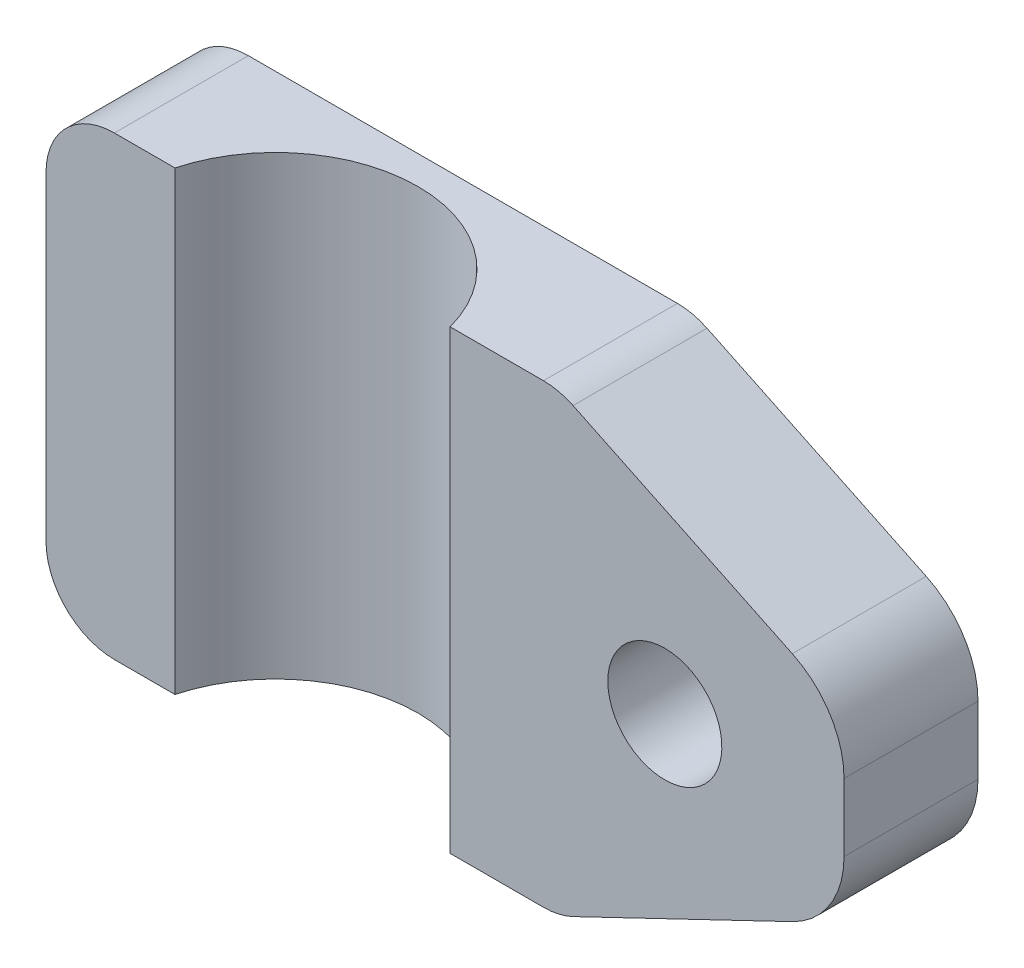
ISO-10303-21;
HEADER;
FILE_DESCRIPTION(('STEP AP214'),'2;1');
FILE_NAME('part.step','',(''),(''),'','','');
FILE_SCHEMA(('AUTOMOTIVE_DESIGN { 1 0 10303 214 1 1 1 1 }'));
ENDSEC;
DATA;
#1=APPLICATION_CONTEXT('core data for automotive mechanical design processes');
#2=APPLICATION_PROTOCOL_DEFINITION('international standard','automotive_design',2000,#1);
#3=PRODUCT_CONTEXT('',#1,'mechanical');
#4=PRODUCT('Part','Part','',(#3));
#5=PRODUCT_RELATED_PRODUCT_CATEGORY('part','',(#4));
#6=PRODUCT_DEFINITION_FORMATION('','',#4);
#7=PRODUCT_DEFINITION_CONTEXT('part definition',#1,'design');
#8=PRODUCT_DEFINITION('design','',#6,#7);
#9=PRODUCT_DEFINITION_SHAPE('','',#8);
#10=(LENGTH_UNIT() NAMED_UNIT(*) SI_UNIT(.MILLI.,.METRE.));
#11=(NAMED_UNIT(*) PLANE_ANGLE_UNIT() SI_UNIT($,.RADIAN.));
#12=(NAMED_UNIT(*) SI_UNIT($,.STERADIAN.) SOLID_ANGLE_UNIT());
#13=UNCERTAINTY_MEASURE_WITH_UNIT(LENGTH_MEASURE(1.E-05),#10,'distance_accuracy_value','');
#14=(GEOMETRIC_REPRESENTATION_CONTEXT(3) GLOBAL_UNCERTAINTY_ASSIGNED_CONTEXT((#13)) GLOBAL_UNIT_ASSIGNED_CONTEXT((#10,
#11,#12)) REPRESENTATION_CONTEXT('',''));
#15=CARTESIAN_POINT('',(0.,0.,0.));
#16=DIRECTION('',(0.,0.,1.));
#17=DIRECTION('',(1.,0.,0.));
#18=AXIS2_PLACEMENT_3D('',#15,#16,#17);
#19=CARTESIAN_POINT('',(0.,20.,10.));
#20=DIRECTION('',(0.,0.,-1.));
#21=DIRECTION('',(-1.,0.,0.));
#22=AXIS2_PLACEMENT_3D('',#19,#20,#21);
#23=PLANE('',#22);
#24=CARTESIAN_POINT('',(19.2809617816466,0.,10.));
#25=DIRECTION('',(0.,0.,-1.));
#26=DIRECTION('',(-1.,0.,0.));
#27=AXIS2_PLACEMENT_3D('',#24,#25,#26);
#28=CIRCLE('',#27,5.);
#29=CARTESIAN_POINT('',(14.2809617816466,0.,10.));
#30=VERTEX_POINT('',#29);
#31=EDGE_CURVE('E195',#30,#30,#28,.T.);
#32=ORIENTED_EDGE('',*,*,#31,.F.);
#33=EDGE_LOOP('',(#32));
#34=FACE_BOUND('',#33,.T.);
#35=DIRECTION('',(1.,0.,0.));
#36=VECTOR('',#35,1.);
#37=CARTESIAN_POINT('',(0.,-20.,10.));
#38=LINE('',#37,#36);
#39=CARTESIAN_POINT('',(-29.,-20.,10.));
#40=VERTEX_POINT('',#39);
#41=CARTESIAN_POINT('',(8.63457537613796,-20.,10.));
#42=VERTEX_POINT('',#41);
#43=EDGE_CURVE('E232',#40,#42,#38,.T.);
#44=ORIENTED_EDGE('',*,*,#43,.F.);
#45=CARTESIAN_POINT('',(-29.,-14.,10.));
#46=DIRECTION('',(0.,0.,1.));
#47=DIRECTION('',(1.,0.,0.));
#48=AXIS2_PLACEMENT_3D('',#45,#46,#47);
#49=CIRCLE('',#48,6.);
#50=CARTESIAN_POINT('',(-35.,-14.,10.));
#51=VERTEX_POINT('',#50);
#52=EDGE_CURVE('E267',#51,#40,#49,.T.);
#53=ORIENTED_EDGE('',*,*,#52,.F.);
#54=DIRECTION('',(0.,-1.,0.));
#55=VECTOR('',#54,1.);
#56=CARTESIAN_POINT('',(-35.,-14.,10.));
#57=LINE('',#56,#55);
#58=CARTESIAN_POINT('',(-35.,14.,10.));
#59=VERTEX_POINT('',#58);
#60=EDGE_CURVE('E265',#59,#51,#57,.T.);
#61=ORIENTED_EDGE('',*,*,#60,.F.);
#62=CARTESIAN_POINT('',(-29.,14.,10.));
#63=DIRECTION('',(0.,0.,1.));
#64=DIRECTION('',(1.,0.,0.));
#65=AXIS2_PLACEMENT_3D('',#62,#63,#64);
#66=CIRCLE('',#65,6.);
#67=CARTESIAN_POINT('',(-29.,20.,10.));
#68=VERTEX_POINT('',#67);
#69=EDGE_CURVE('E210',#68,#59,#66,.T.);
#70=ORIENTED_EDGE('',*,*,#69,.F.);
#71=DIRECTION('',(1.,0.,0.));
#72=VECTOR('',#71,1.);
#73=CARTESIAN_POINT('',(0.,20.,10.));
#74=LINE('',#73,#72);
#75=CARTESIAN_POINT('',(8.63457537613795,20.,10.));
#76=VERTEX_POINT('',#75);
#77=EDGE_CURVE('E235',#68,#76,#74,.T.);
#78=ORIENTED_EDGE('',*,*,#77,.T.);
#79=CARTESIAN_POINT('',(8.63457537613795,14.,10.));
#80=DIRECTION('',(0.,0.,1.));
#81=DIRECTION('',(1.,0.,0.));
#82=AXIS2_PLACEMENT_3D('',#79,#80,#81);
#83=CIRCLE('',#82,6.);
#84=CARTESIAN_POINT('',(11.2309617816466,19.4091383448096,10.));
#85=VERTEX_POINT('',#84);
#86=EDGE_CURVE('E258',#85,#76,#83,.T.);
#87=ORIENTED_EDGE('',*,*,#86,.F.);
#88=DIRECTION('',(-0.901523057468274,0.432731067584771,0.));
#89=VECTOR('',#88,1.);
#90=CARTESIAN_POINT('',(11.2309617816466,19.4091383448096,10.));
#91=LINE('',#90,#89);
#92=CARTESIAN_POINT('',(30.4618485406782,10.1783127004745,10.));
#93=VERTEX_POINT('',#92);
#94=EDGE_CURVE('E255',#93,#85,#91,.T.);
#95=ORIENTED_EDGE('',*,*,#94,.F.);
#96=CARTESIAN_POINT('',(27.,2.96612824072829,10.));
#97=DIRECTION('',(0.,0.,1.));
#98=DIRECTION('',(1.,0.,0.));
#99=AXIS2_PLACEMENT_3D('',#96,#97,#98);
#100=CIRCLE('',#99,8.00000000000001);
#101=CARTESIAN_POINT('',(35.,2.96612824072829,10.));
#102=VERTEX_POINT('',#101);
#103=EDGE_CURVE('E252',#102,#93,#100,.T.);
#104=ORIENTED_EDGE('',*,*,#103,.F.);
#105=DIRECTION('',(0.,1.,0.));
#106=VECTOR('',#105,1.);
#107=CARTESIAN_POINT('',(35.,2.96612824072829,10.));
#108=LINE('',#107,#106);
#109=CARTESIAN_POINT('',(35.,-2.96612824072827,10.));
#110=VERTEX_POINT('',#109);
#111=EDGE_CURVE('E249',#110,#102,#108,.T.);
#112=ORIENTED_EDGE('',*,*,#111,.F.);
#113=CARTESIAN_POINT('',(27.,-2.96612824072827,10.));
#114=DIRECTION('',(0.,0.,1.));
#115=DIRECTION('',(1.,0.,0.));
#116=AXIS2_PLACEMENT_3D('',#113,#114,#115);
#117=CIRCLE('',#116,8.);
#118=CARTESIAN_POINT('',(30.4618485406782,-10.1783127004745,10.));
#119=VERTEX_POINT('',#118);
#120=EDGE_CURVE('E246',#119,#110,#117,.T.);
#121=ORIENTED_EDGE('',*,*,#120,.F.);
#122=DIRECTION('',(0.901523057468274,0.432731067584772,0.));
#123=VECTOR('',#122,1.);
#124=CARTESIAN_POINT('',(11.2309617816466,-19.4091383448096,10.));
#125=LINE('',#124,#123);
#126=CARTESIAN_POINT('',(11.2309617816466,-19.4091383448096,10.));
#127=VERTEX_POINT('',#126);
#128=EDGE_CURVE('E236',#127,#119,#125,.T.);
#129=ORIENTED_EDGE('',*,*,#128,.F.);
#130=CARTESIAN_POINT('',(8.63457537613795,-14.,10.));
#131=DIRECTION('',(0.,0.,1.));
#132=DIRECTION('',(1.,0.,0.));
#133=AXIS2_PLACEMENT_3D('',#130,#131,#132);
#134=CIRCLE('',#133,6.00000000000001);
#135=EDGE_CURVE('E261',#42,#127,#134,.T.);
#136=ORIENTED_EDGE('',*,*,#135,.F.);
#137=EDGE_LOOP('',(#44,#53,#61,#70,#78,#87,#95,#104,#112,#121,#129,#136));
#138=FACE_BOUND('',#137,.T.);
#139=DIRECTION('',(0.,-1.,0.));
#140=VECTOR('',#139,1.);
#141=CARTESIAN_POINT('',(5.63457537613795,11.,10.));
#142=LINE('',#141,#140);
#143=CARTESIAN_POINT('',(5.63457537613795,11.,10.));
#144=VERTEX_POINT('',#143);
#145=CARTESIAN_POINT('',(5.63457537613795,-10.9999999999999,10.));
#146=VERTEX_POINT('',#145);
#147=EDGE_CURVE('E288',#144,#146,#142,.T.);
#148=ORIENTED_EDGE('',*,*,#147,.F.);
#149=CARTESIAN_POINT('',(2.63457537613795,11.,10.));
#150=DIRECTION('',(0.,0.,1.));
#151=DIRECTION('',(1.,0.,0.));
#152=AXIS2_PLACEMENT_3D('',#149,#150,#151);
#153=CIRCLE('',#152,3.);
#154=CARTESIAN_POINT('',(2.63457537613791,14.,10.));
#155=VERTEX_POINT('',#154);
#156=EDGE_CURVE('E310',#144,#155,#153,.T.);
#157=ORIENTED_EDGE('',*,*,#156,.T.);
#158=DIRECTION('',(1.,0.,0.));
#159=VECTOR('',#158,1.);
#160=CARTESIAN_POINT('',(-26.,14.,10.));
#161=LINE('',#160,#159);
#162=CARTESIAN_POINT('',(-26.,14.,10.));
#163=VERTEX_POINT('',#162);
#164=EDGE_CURVE('E307',#163,#155,#161,.T.);
#165=ORIENTED_EDGE('',*,*,#164,.F.);
#166=CARTESIAN_POINT('',(-26.,11.,10.));
#167=DIRECTION('',(0.,0.,1.));
#168=DIRECTION('',(1.,0.,0.));
#169=AXIS2_PLACEMENT_3D('',#166,#167,#168);
#170=CIRCLE('',#169,3.);
#171=CARTESIAN_POINT('',(-29.,11.,10.));
#172=VERTEX_POINT('',#171);
#173=EDGE_CURVE('E304',#163,#172,#170,.T.);
#174=ORIENTED_EDGE('',*,*,#173,.T.);
#175=DIRECTION('',(0.,1.,0.));
#176=VECTOR('',#175,1.);
#177=CARTESIAN_POINT('',(-29.,-11.,10.));
#178=LINE('',#177,#176);
#179=CARTESIAN_POINT('',(-29.,-11.,10.));
#180=VERTEX_POINT('',#179);
#181=EDGE_CURVE('E301',#180,#172,#178,.T.);
#182=ORIENTED_EDGE('',*,*,#181,.F.);
#183=CARTESIAN_POINT('',(-26.,-11.,10.));
#184=DIRECTION('',(0.,0.,1.));
#185=DIRECTION('',(1.,0.,0.));
#186=AXIS2_PLACEMENT_3D('',#183,#184,#185);
#187=CIRCLE('',#186,3.);
#188=CARTESIAN_POINT('',(-26.,-14.,10.));
#189=VERTEX_POINT('',#188);
#190=EDGE_CURVE('E298',#180,#189,#187,.T.);
#191=ORIENTED_EDGE('',*,*,#190,.T.);
#192=DIRECTION('',(-1.,0.,0.));
#193=VECTOR('',#192,1.);
#194=CARTESIAN_POINT('',(2.63457537613792,-14.,10.));
#195=LINE('',#194,#193);
#196=CARTESIAN_POINT('',(2.63457537613792,-14.,10.));
#197=VERTEX_POINT('',#196);
#198=EDGE_CURVE('E295',#197,#189,#195,.T.);
#199=ORIENTED_EDGE('',*,*,#198,.F.);
#200=CARTESIAN_POINT('',(2.63457537613796,-11.,10.));
#201=DIRECTION('',(0.,0.,1.));
#202=DIRECTION('',(1.,0.,0.));
#203=AXIS2_PLACEMENT_3D('',#200,#201,#202);
#204=CIRCLE('',#203,3.);
#205=EDGE_CURVE('E292',#197,#146,#204,.T.);
#206=ORIENTED_EDGE('',*,*,#205,.T.);
#207=EDGE_LOOP('',(#148,#157,#165,#174,#182,#191,#199,#206));
#208=FACE_BOUND('',#207,.T.);
#209=ADVANCED_FACE('F38',(#34,#138,#208),#23,.T.);
#210=CARTESIAN_POINT('',(-29.,20.,25.));
#211=DIRECTION('',(0.,-1.,0.));
#212=DIRECTION('',(1.,0.,0.));
#213=AXIS2_PLACEMENT_3D('',#210,#211,#212);
#214=PLANE('',#213);
#215=DIRECTION('',(0.,0.,-1.));
#216=VECTOR('',#215,1.);
#217=CARTESIAN_POINT('',(-29.,20.,25.));
#218=LINE('',#217,#216);
#219=CARTESIAN_POINT('',(-29.,20.,21.75));
#220=VERTEX_POINT('',#219);
#221=EDGE_CURVE('E47',#220,#68,#218,.T.);
#222=ORIENTED_EDGE('',*,*,#221,.F.);
#223=DIRECTION('',(-1.,0.,0.));
#224=VECTOR('',#223,1.);
#225=CARTESIAN_POINT('',(35.,20.,21.75));
#226=LINE('',#225,#224);
#227=CARTESIAN_POINT('',(-23.6900768243044,20.,21.75));
#228=VERTEX_POINT('',#227);
#229=EDGE_CURVE('E191',#228,#220,#226,.T.);
#230=ORIENTED_EDGE('',*,*,#229,.F.);
#231=CARTESIAN_POINT('',(-11.619969119731,20.,25.));
#232=DIRECTION('',(0.,-1.,0.));
#233=DIRECTION('',(1.,0.,0.));
#234=AXIS2_PLACEMENT_3D('',#231,#232,#233);
#235=CIRCLE('',#234,12.5);
#236=CARTESIAN_POINT('',(0.450138584842276,20.,21.75));
#237=VERTEX_POINT('',#236);
#238=EDGE_CURVE('E231',#228,#237,#235,.T.);
#239=ORIENTED_EDGE('',*,*,#238,.T.);
#240=CARTESIAN_POINT('',(8.63457537613795,20.,21.75));
#241=VERTEX_POINT('',#240);
#242=EDGE_CURVE('E54',#241,#237,#226,.T.);
#243=ORIENTED_EDGE('',*,*,#242,.F.);
#244=DIRECTION('',(0.,0.,-1.));
#245=VECTOR('',#244,1.);
#246=CARTESIAN_POINT('',(8.63457537613795,20.,25.));
#247=LINE('',#246,#245);
#248=EDGE_CURVE('E12',#241,#76,#247,.T.);
#249=ORIENTED_EDGE('',*,*,#248,.T.);
#250=ORIENTED_EDGE('',*,*,#77,.F.);
#251=EDGE_LOOP('',(#222,#230,#239,#243,#249,#250));
#252=FACE_BOUND('',#251,.T.);
#253=ADVANCED_FACE('F392',(#252),#214,.F.);
#254=CARTESIAN_POINT('',(-29.,-20.,25.));
#255=DIRECTION('',(0.,1.,0.));
#256=DIRECTION('',(-1.,0.,0.));
#257=AXIS2_PLACEMENT_3D('',#254,#255,#256);
#258=PLANE('',#257);
#259=DIRECTION('',(0.,0.,-1.));
#260=VECTOR('',#259,1.);
#261=CARTESIAN_POINT('',(8.63457537613796,-20.,25.));
#262=LINE('',#261,#260);
#263=CARTESIAN_POINT('',(8.63457537613795,-20.,21.75));
#264=VERTEX_POINT('',#263);
#265=EDGE_CURVE('E217',#264,#42,#262,.T.);
#266=ORIENTED_EDGE('',*,*,#265,.F.);
#267=DIRECTION('',(-1.,0.,0.));
#268=VECTOR('',#267,1.);
#269=CARTESIAN_POINT('',(35.,-20.,21.75));
#270=LINE('',#269,#268);
#271=CARTESIAN_POINT('',(0.450138584842281,-20.,21.75));
#272=VERTEX_POINT('',#271);
#273=EDGE_CURVE('E357',#264,#272,#270,.T.);
#274=ORIENTED_EDGE('',*,*,#273,.T.);
#275=CARTESIAN_POINT('',(-11.619969119731,-20.,25.));
#276=DIRECTION('',(0.,-1.,0.));
#277=DIRECTION('',(1.,0.,0.));
#278=AXIS2_PLACEMENT_3D('',#275,#276,#277);
#279=CIRCLE('',#278,12.5);
#280=CARTESIAN_POINT('',(-23.6900768243043,-20.,21.75));
#281=VERTEX_POINT('',#280);
#282=EDGE_CURVE('E239',#281,#272,#279,.T.);
#283=ORIENTED_EDGE('',*,*,#282,.F.);
#284=CARTESIAN_POINT('',(-29.,-20.,21.75));
#285=VERTEX_POINT('',#284);
#286=EDGE_CURVE('E62',#281,#285,#270,.T.);
#287=ORIENTED_EDGE('',*,*,#286,.T.);
#288=DIRECTION('',(0.,0.,-1.));
#289=VECTOR('',#288,1.);
#290=CARTESIAN_POINT('',(-29.,-20.,25.));
#291=LINE('',#290,#289);
#292=EDGE_CURVE('E213',#285,#40,#291,.T.);
#293=ORIENTED_EDGE('',*,*,#292,.T.);
#294=ORIENTED_EDGE('',*,*,#43,.T.);
#295=EDGE_LOOP('',(#266,#274,#283,#287,#293,#294));
#296=FACE_BOUND('',#295,.T.);
#297=ADVANCED_FACE('F383',(#296),#258,.F.);
#298=CARTESIAN_POINT('',(8.63457537613795,14.,25.));
#299=DIRECTION('',(0.,0.,-1.));
#300=DIRECTION('',(-1.,0.,0.));
#301=AXIS2_PLACEMENT_3D('',#298,#299,#300);
#302=CYLINDRICAL_SURFACE('',#301,6.);
#303=ORIENTED_EDGE('',*,*,#248,.F.);
#304=CARTESIAN_POINT('',(8.63457537613795,14.,21.75));
#305=DIRECTION('',(0.,0.,-1.));
#306=DIRECTION('',(0.,1.,0.));
#307=AXIS2_PLACEMENT_3D('',#304,#305,#306);
#308=CIRCLE('',#307,6.);
#309=CARTESIAN_POINT('',(11.2309617816466,19.4091383448096,21.75));
#310=VERTEX_POINT('',#309);
#311=EDGE_CURVE('E343',#241,#310,#308,.T.);
#312=ORIENTED_EDGE('',*,*,#311,.T.);
#313=DIRECTION('',(0.,0.,-1.));
#314=VECTOR('',#313,1.);
#315=CARTESIAN_POINT('',(11.2309617816466,19.4091383448096,25.));
#316=LINE('',#315,#314);
#317=EDGE_CURVE('E229',#310,#85,#316,.T.);
#318=ORIENTED_EDGE('',*,*,#317,.T.);
#319=ORIENTED_EDGE('',*,*,#86,.T.);
#320=EDGE_LOOP('',(#303,#312,#318,#319));
#321=FACE_BOUND('',#320,.T.);
#322=ADVANCED_FACE('F40',(#321),#302,.T.);
#323=CARTESIAN_POINT('',(-29.,14.,25.));
#324=DIRECTION('',(0.,0.,-1.));
#325=DIRECTION('',(-1.,0.,0.));
#326=AXIS2_PLACEMENT_3D('',#323,#324,#325);
#327=CYLINDRICAL_SURFACE('',#326,6.);
#328=DIRECTION('',(0.,0.,-1.));
#329=VECTOR('',#328,1.);
#330=CARTESIAN_POINT('',(-35.,14.,25.));
#331=LINE('',#330,#329);
#332=CARTESIAN_POINT('',(-35.,14.,21.75));
#333=VERTEX_POINT('',#332);
#334=EDGE_CURVE('E202',#333,#59,#331,.T.);
#335=ORIENTED_EDGE('',*,*,#334,.F.);
#336=CARTESIAN_POINT('',(-29.,14.,21.75));
#337=DIRECTION('',(0.,0.,-1.));
#338=DIRECTION('',(0.,1.,0.));
#339=AXIS2_PLACEMENT_3D('',#336,#337,#338);
#340=CIRCLE('',#339,6.);
#341=EDGE_CURVE('E185',#333,#220,#340,.T.);
#342=ORIENTED_EDGE('',*,*,#341,.T.);
#343=ORIENTED_EDGE('',*,*,#221,.T.);
#344=ORIENTED_EDGE('',*,*,#69,.T.);
#345=EDGE_LOOP('',(#335,#342,#343,#344));
#346=FACE_BOUND('',#345,.T.);
#347=ADVANCED_FACE('F208',(#346),#327,.T.);
#348=CARTESIAN_POINT('',(-35.,-14.,25.));
#349=DIRECTION('',(1.,0.,0.));
#350=DIRECTION('',(0.,1.,0.));
#351=AXIS2_PLACEMENT_3D('',#348,#349,#350);
#352=PLANE('',#351);
#353=DIRECTION('',(0.,0.,-1.));
#354=VECTOR('',#353,1.);
#355=CARTESIAN_POINT('',(-35.,-14.,25.));
#356=LINE('',#355,#354);
#357=CARTESIAN_POINT('',(-35.,-14.,21.75));
#358=VERTEX_POINT('',#357);
#359=EDGE_CURVE('E204',#358,#51,#356,.T.);
#360=ORIENTED_EDGE('',*,*,#359,.F.);
#361=DIRECTION('',(0.,-1.,0.));
#362=VECTOR('',#361,1.);
#363=CARTESIAN_POINT('',(-35.,20.,21.75));
#364=LINE('',#363,#362);
#365=EDGE_CURVE('E188',#333,#358,#364,.T.);
#366=ORIENTED_EDGE('',*,*,#365,.F.);
#367=ORIENTED_EDGE('',*,*,#334,.T.);
#368=ORIENTED_EDGE('',*,*,#60,.T.);
#369=EDGE_LOOP('',(#360,#366,#367,#368));
#370=FACE_BOUND('',#369,.T.);
#371=ADVANCED_FACE('F200',(#370),#352,.F.);
#372=CARTESIAN_POINT('',(-29.,-14.,25.));
#373=DIRECTION('',(0.,0.,-1.));
#374=DIRECTION('',(-1.,0.,0.));
#375=AXIS2_PLACEMENT_3D('',#372,#373,#374);
#376=CYLINDRICAL_SURFACE('',#375,6.);
#377=ORIENTED_EDGE('',*,*,#292,.F.);
#378=CARTESIAN_POINT('',(-29.,-14.,21.75));
#379=DIRECTION('',(0.,0.,-1.));
#380=DIRECTION('',(0.,1.,0.));
#381=AXIS2_PLACEMENT_3D('',#378,#379,#380);
#382=CIRCLE('',#381,6.);
#383=EDGE_CURVE('E196',#285,#358,#382,.T.);
#384=ORIENTED_EDGE('',*,*,#383,.T.);
#385=ORIENTED_EDGE('',*,*,#359,.T.);
#386=ORIENTED_EDGE('',*,*,#52,.T.);
#387=EDGE_LOOP('',(#377,#384,#385,#386));
#388=FACE_BOUND('',#387,.T.);
#389=ADVANCED_FACE('F388',(#388),#376,.T.);
#390=CARTESIAN_POINT('',(8.63457537613795,-14.,25.));
#391=DIRECTION('',(0.,0.,-1.));
#392=DIRECTION('',(-1.,0.,0.));
#393=AXIS2_PLACEMENT_3D('',#390,#391,#392);
#394=CYLINDRICAL_SURFACE('',#393,6.00000000000001);
#395=DIRECTION('',(0.,0.,-1.));
#396=VECTOR('',#395,1.);
#397=CARTESIAN_POINT('',(11.2309617816466,-19.4091383448096,25.));
#398=LINE('',#397,#396);
#399=CARTESIAN_POINT('',(11.2309617816466,-19.4091383448096,21.75));
#400=VERTEX_POINT('',#399);
#401=EDGE_CURVE('E219',#400,#127,#398,.T.);
#402=ORIENTED_EDGE('',*,*,#401,.F.);
#403=CARTESIAN_POINT('',(8.63457537613795,-14.,21.75));
#404=DIRECTION('',(0.,0.,-1.));
#405=DIRECTION('',(0.,1.,0.));
#406=AXIS2_PLACEMENT_3D('',#403,#404,#405);
#407=CIRCLE('',#406,6.00000000000001);
#408=EDGE_CURVE('E334',#400,#264,#407,.T.);
#409=ORIENTED_EDGE('',*,*,#408,.T.);
#410=ORIENTED_EDGE('',*,*,#265,.T.);
#411=ORIENTED_EDGE('',*,*,#135,.T.);
#412=EDGE_LOOP('',(#402,#409,#410,#411));
#413=FACE_BOUND('',#412,.T.);
#414=ADVANCED_FACE('F379',(#413),#394,.T.);
#415=CARTESIAN_POINT('',(11.2309617816466,-19.4091383448096,25.));
#416=DIRECTION('',(-0.432731067584772,0.901523057468274,0.));
#417=DIRECTION('',(-0.901523057468274,-0.432731067584772,0.));
#418=AXIS2_PLACEMENT_3D('',#415,#416,#417);
#419=PLANE('',#418);
#420=DIRECTION('',(0.,0.,-1.));
#421=VECTOR('',#420,1.);
#422=CARTESIAN_POINT('',(30.4618485406782,-10.1783127004745,25.));
#423=LINE('',#422,#421);
#424=CARTESIAN_POINT('',(30.4618485406782,-10.1783127004745,21.75));
#425=VERTEX_POINT('',#424);
#426=EDGE_CURVE('E221',#425,#119,#423,.T.);
#427=ORIENTED_EDGE('',*,*,#426,.F.);
#428=DIRECTION('',(-0.901523057468274,-0.432731067584772,0.));
#429=VECTOR('',#428,1.);
#430=CARTESIAN_POINT('',(11.2309617816466,-19.4091383448096,21.75));
#431=LINE('',#430,#429);
#432=EDGE_CURVE('E337',#425,#400,#431,.T.);
#433=ORIENTED_EDGE('',*,*,#432,.T.);
#434=ORIENTED_EDGE('',*,*,#401,.T.);
#435=ORIENTED_EDGE('',*,*,#128,.T.);
#436=EDGE_LOOP('',(#427,#433,#434,#435));
#437=FACE_BOUND('',#436,.T.);
#438=ADVANCED_FACE('F376',(#437),#419,.F.);
#439=CARTESIAN_POINT('',(27.,-2.96612824072827,25.));
#440=DIRECTION('',(0.,0.,-1.));
#441=DIRECTION('',(-1.,0.,0.));
#442=AXIS2_PLACEMENT_3D('',#439,#440,#441);
#443=CYLINDRICAL_SURFACE('',#442,8.);
#444=DIRECTION('',(0.,0.,-1.));
#445=VECTOR('',#444,1.);
#446=CARTESIAN_POINT('',(35.,-2.96612824072827,25.));
#447=LINE('',#446,#445);
#448=CARTESIAN_POINT('',(35.,-2.96612824072827,21.75));
#449=VERTEX_POINT('',#448);
#450=EDGE_CURVE('E223',#449,#110,#447,.T.);
#451=ORIENTED_EDGE('',*,*,#450,.F.);
#452=CARTESIAN_POINT('',(27.,-2.96612824072827,21.75));
#453=DIRECTION('',(0.,0.,-1.));
#454=DIRECTION('',(0.,1.,0.));
#455=AXIS2_PLACEMENT_3D('',#452,#453,#454);
#456=CIRCLE('',#455,8.);
#457=EDGE_CURVE('E340',#449,#425,#456,.T.);
#458=ORIENTED_EDGE('',*,*,#457,.T.);
#459=ORIENTED_EDGE('',*,*,#426,.T.);
#460=ORIENTED_EDGE('',*,*,#120,.T.);
#461=EDGE_LOOP('',(#451,#458,#459,#460));
#462=FACE_BOUND('',#461,.T.);
#463=ADVANCED_FACE('F366',(#462),#443,.T.);
#464=CARTESIAN_POINT('',(35.,2.96612824072829,25.));
#465=DIRECTION('',(-1.,0.,0.));
#466=DIRECTION('',(0.,0.,1.));
#467=AXIS2_PLACEMENT_3D('',#464,#465,#466);
#468=PLANE('',#467);
#469=DIRECTION('',(0.,0.,-1.));
#470=VECTOR('',#469,1.);
#471=CARTESIAN_POINT('',(35.,2.96612824072829,25.));
#472=LINE('',#471,#470);
#473=CARTESIAN_POINT('',(35.,2.96612824072829,21.75));
#474=VERTEX_POINT('',#473);
#475=EDGE_CURVE('E225',#474,#102,#472,.T.);
#476=ORIENTED_EDGE('',*,*,#475,.F.);
#477=DIRECTION('',(0.,-1.,0.));
#478=VECTOR('',#477,1.);
#479=CARTESIAN_POINT('',(35.,20.,21.75));
#480=LINE('',#479,#478);
#481=EDGE_CURVE('E205',#474,#449,#480,.T.);
#482=ORIENTED_EDGE('',*,*,#481,.T.);
#483=ORIENTED_EDGE('',*,*,#450,.T.);
#484=ORIENTED_EDGE('',*,*,#111,.T.);
#485=EDGE_LOOP('',(#476,#482,#483,#484));
#486=FACE_BOUND('',#485,.T.);
#487=ADVANCED_FACE('F363',(#486),#468,.F.);
#488=CARTESIAN_POINT('',(27.,2.96612824072829,25.));
#489=DIRECTION('',(0.,0.,-1.));
#490=DIRECTION('',(-1.,0.,0.));
#491=AXIS2_PLACEMENT_3D('',#488,#489,#490);
#492=CYLINDRICAL_SURFACE('',#491,8.00000000000001);
#493=DIRECTION('',(0.,0.,-1.));
#494=VECTOR('',#493,1.);
#495=CARTESIAN_POINT('',(30.4618485406782,10.1783127004745,25.));
#496=LINE('',#495,#494);
#497=CARTESIAN_POINT('',(30.4618485406782,10.1783127004745,21.75));
#498=VERTEX_POINT('',#497);
#499=EDGE_CURVE('E227',#498,#93,#496,.T.);
#500=ORIENTED_EDGE('',*,*,#499,.F.);
#501=CARTESIAN_POINT('',(27.,2.96612824072829,21.75));
#502=DIRECTION('',(0.,0.,-1.));
#503=DIRECTION('',(0.,1.,0.));
#504=AXIS2_PLACEMENT_3D('',#501,#502,#503);
#505=CIRCLE('',#504,8.00000000000001);
#506=EDGE_CURVE('E346',#498,#474,#505,.T.);
#507=ORIENTED_EDGE('',*,*,#506,.T.);
#508=ORIENTED_EDGE('',*,*,#475,.T.);
#509=ORIENTED_EDGE('',*,*,#103,.T.);
#510=EDGE_LOOP('',(#500,#507,#508,#509));
#511=FACE_BOUND('',#510,.T.);
#512=ADVANCED_FACE('F401',(#511),#492,.T.);
#513=CARTESIAN_POINT('',(11.2309617816466,19.4091383448096,25.));
#514=DIRECTION('',(-0.432731067584771,-0.901523057468274,0.));
#515=DIRECTION('',(0.901523057468274,-0.432731067584771,0.));
#516=AXIS2_PLACEMENT_3D('',#513,#514,#515);
#517=PLANE('',#516);
#518=ORIENTED_EDGE('',*,*,#317,.F.);
#519=DIRECTION('',(0.901523057468274,-0.432731067584771,0.));
#520=VECTOR('',#519,1.);
#521=CARTESIAN_POINT('',(11.2309617816466,19.4091383448096,21.75));
#522=LINE('',#521,#520);
#523=EDGE_CURVE('E349',#310,#498,#522,.T.);
#524=ORIENTED_EDGE('',*,*,#523,.T.);
#525=ORIENTED_EDGE('',*,*,#499,.T.);
#526=ORIENTED_EDGE('',*,*,#94,.T.);
#527=EDGE_LOOP('',(#518,#524,#525,#526));
#528=FACE_BOUND('',#527,.T.);
#529=ADVANCED_FACE('F398',(#528),#517,.F.);
#530=CARTESIAN_POINT('',(-11.619969119731,20.,25.));
#531=DIRECTION('',(0.,-1.,0.));
#532=DIRECTION('',(1.,0.,0.));
#533=AXIS2_PLACEMENT_3D('',#530,#531,#532);
#534=CYLINDRICAL_SURFACE('',#533,12.5);
#535=ORIENTED_EDGE('',*,*,#282,.T.);
#536=DIRECTION('',(0.,-1.,0.));
#537=VECTOR('',#536,1.);
#538=CARTESIAN_POINT('',(0.450138584842276,20.,21.75));
#539=LINE('',#538,#537);
#540=EDGE_CURVE('E352',#272,#237,#539,.F.);
#541=ORIENTED_EDGE('',*,*,#540,.T.);
#542=ORIENTED_EDGE('',*,*,#238,.F.);
#543=DIRECTION('',(0.,-1.,0.));
#544=VECTOR('',#543,1.);
#545=CARTESIAN_POINT('',(-23.6900768243044,20.,21.75));
#546=LINE('',#545,#544);
#547=EDGE_CURVE('E354',#228,#281,#546,.T.);
#548=ORIENTED_EDGE('',*,*,#547,.T.);
#549=EDGE_LOOP('',(#535,#541,#542,#548));
#550=FACE_BOUND('',#549,.T.);
#551=ADVANCED_FACE('F426',(#550),#534,.F.);
#552=CARTESIAN_POINT('',(2.63457537613795,11.,11.));
#553=DIRECTION('',(0.,0.,-1.));
#554=DIRECTION('',(-1.,0.,0.));
#555=AXIS2_PLACEMENT_3D('',#552,#553,#554);
#556=CYLINDRICAL_SURFACE('',#555,3.);
#557=ORIENTED_EDGE('',*,*,#156,.F.);
#558=DIRECTION('',(0.,0.,-1.));
#559=VECTOR('',#558,1.);
#560=CARTESIAN_POINT('',(5.63457537613795,11.,11.));
#561=LINE('',#560,#559);
#562=CARTESIAN_POINT('',(5.63457537613795,11.,11.));
#563=VERTEX_POINT('',#562);
#564=EDGE_CURVE('E284',#563,#144,#561,.T.);
#565=ORIENTED_EDGE('',*,*,#564,.F.);
#566=CARTESIAN_POINT('',(2.63457537613795,11.,11.));
#567=DIRECTION('',(0.,0.,1.));
#568=DIRECTION('',(1.,0.,0.));
#569=AXIS2_PLACEMENT_3D('',#566,#567,#568);
#570=CIRCLE('',#569,3.);
#571=CARTESIAN_POINT('',(2.63457537613791,14.,11.));
#572=VERTEX_POINT('',#571);
#573=EDGE_CURVE('E291',#563,#572,#570,.T.);
#574=ORIENTED_EDGE('',*,*,#573,.T.);
#575=DIRECTION('',(0.,0.,-1.));
#576=VECTOR('',#575,1.);
#577=CARTESIAN_POINT('',(2.63457537613791,14.,11.));
#578=LINE('',#577,#576);
#579=EDGE_CURVE('E270',#572,#155,#578,.T.);
#580=ORIENTED_EDGE('',*,*,#579,.T.);
#581=EDGE_LOOP('',(#557,#565,#574,#580));
#582=FACE_BOUND('',#581,.T.);
#583=ADVANCED_FACE('F473',(#582),#556,.F.);
#584=CARTESIAN_POINT('',(-26.,14.,11.));
#585=DIRECTION('',(0.,1.,0.));
#586=DIRECTION('',(0.,0.,1.));
#587=AXIS2_PLACEMENT_3D('',#584,#585,#586);
#588=PLANE('',#587);
#589=ORIENTED_EDGE('',*,*,#164,.T.);
#590=ORIENTED_EDGE('',*,*,#579,.F.);
#591=DIRECTION('',(1.,0.,0.));
#592=VECTOR('',#591,1.);
#593=CARTESIAN_POINT('',(-26.,14.,11.));
#594=LINE('',#593,#592);
#595=CARTESIAN_POINT('',(-26.,14.,11.));
#596=VERTEX_POINT('',#595);
#597=EDGE_CURVE('E327',#596,#572,#594,.T.);
#598=ORIENTED_EDGE('',*,*,#597,.F.);
#599=DIRECTION('',(0.,0.,-1.));
#600=VECTOR('',#599,1.);
#601=CARTESIAN_POINT('',(-26.,14.,11.));
#602=LINE('',#601,#600);
#603=EDGE_CURVE('E272',#596,#163,#602,.T.);
#604=ORIENTED_EDGE('',*,*,#603,.T.);
#605=EDGE_LOOP('',(#589,#590,#598,#604));
#606=FACE_BOUND('',#605,.T.);
#607=ADVANCED_FACE('F489',(#606),#588,.F.);
#608=CARTESIAN_POINT('',(-26.,11.,11.));
#609=DIRECTION('',(0.,0.,-1.));
#610=DIRECTION('',(-1.,0.,0.));
#611=AXIS2_PLACEMENT_3D('',#608,#609,#610);
#612=CYLINDRICAL_SURFACE('',#611,3.);
#613=ORIENTED_EDGE('',*,*,#173,.F.);
#614=ORIENTED_EDGE('',*,*,#603,.F.);
#615=CARTESIAN_POINT('',(-26.,11.,11.));
#616=DIRECTION('',(0.,0.,1.));
#617=DIRECTION('',(1.,0.,0.));
#618=AXIS2_PLACEMENT_3D('',#615,#616,#617);
#619=CIRCLE('',#618,3.);
#620=CARTESIAN_POINT('',(-29.,11.,11.));
#621=VERTEX_POINT('',#620);
#622=EDGE_CURVE('E325',#596,#621,#619,.T.);
#623=ORIENTED_EDGE('',*,*,#622,.T.);
#624=DIRECTION('',(0.,0.,-1.));
#625=VECTOR('',#624,1.);
#626=CARTESIAN_POINT('',(-29.,11.,11.));
#627=LINE('',#626,#625);
#628=EDGE_CURVE('E274',#621,#172,#627,.T.);
#629=ORIENTED_EDGE('',*,*,#628,.T.);
#630=EDGE_LOOP('',(#613,#614,#623,#629));
#631=FACE_BOUND('',#630,.T.);
#632=ADVANCED_FACE('F497',(#631),#612,.F.);
#633=CARTESIAN_POINT('',(-29.,-11.,11.));
#634=DIRECTION('',(-1.,0.,0.));
#635=DIRECTION('',(0.,0.,1.));
#636=AXIS2_PLACEMENT_3D('',#633,#634,#635);
#637=PLANE('',#636);
#638=ORIENTED_EDGE('',*,*,#181,.T.);
#639=ORIENTED_EDGE('',*,*,#628,.F.);
#640=DIRECTION('',(0.,1.,0.));
#641=VECTOR('',#640,1.);
#642=CARTESIAN_POINT('',(-29.,-11.,11.));
#643=LINE('',#642,#641);
#644=CARTESIAN_POINT('',(-29.,-11.,11.));
#645=VERTEX_POINT('',#644);
#646=EDGE_CURVE('E322',#645,#621,#643,.T.);
#647=ORIENTED_EDGE('',*,*,#646,.F.);
#648=DIRECTION('',(0.,0.,-1.));
#649=VECTOR('',#648,1.);
#650=CARTESIAN_POINT('',(-29.,-11.,11.));
#651=LINE('',#650,#649);
#652=EDGE_CURVE('E276',#645,#180,#651,.T.);
#653=ORIENTED_EDGE('',*,*,#652,.T.);
#654=EDGE_LOOP('',(#638,#639,#647,#653));
#655=FACE_BOUND('',#654,.T.);
#656=ADVANCED_FACE('F506',(#655),#637,.F.);
#657=CARTESIAN_POINT('',(-26.,-11.,11.));
#658=DIRECTION('',(0.,0.,-1.));
#659=DIRECTION('',(-1.,0.,0.));
#660=AXIS2_PLACEMENT_3D('',#657,#658,#659);
#661=CYLINDRICAL_SURFACE('',#660,3.);
#662=ORIENTED_EDGE('',*,*,#190,.F.);
#663=ORIENTED_EDGE('',*,*,#652,.F.);
#664=CARTESIAN_POINT('',(-26.,-11.,11.));
#665=DIRECTION('',(0.,0.,1.));
#666=DIRECTION('',(1.,0.,0.));
#667=AXIS2_PLACEMENT_3D('',#664,#665,#666);
#668=CIRCLE('',#667,3.);
#669=CARTESIAN_POINT('',(-26.,-14.,11.));
#670=VERTEX_POINT('',#669);
#671=EDGE_CURVE('E320',#645,#670,#668,.T.);
#672=ORIENTED_EDGE('',*,*,#671,.T.);
#673=DIRECTION('',(0.,0.,-1.));
#674=VECTOR('',#673,1.);
#675=CARTESIAN_POINT('',(-26.,-14.,11.));
#676=LINE('',#675,#674);
#677=EDGE_CURVE('E278',#670,#189,#676,.T.);
#678=ORIENTED_EDGE('',*,*,#677,.T.);
#679=EDGE_LOOP('',(#662,#663,#672,#678));
#680=FACE_BOUND('',#679,.T.);
#681=ADVANCED_FACE('F515',(#680),#661,.F.);
#682=CARTESIAN_POINT('',(2.63457537613792,-14.,11.));
#683=DIRECTION('',(0.,-1.,0.));
#684=DIRECTION('',(0.,0.,-1.));
#685=AXIS2_PLACEMENT_3D('',#682,#683,#684);
#686=PLANE('',#685);
#687=ORIENTED_EDGE('',*,*,#198,.T.);
#688=ORIENTED_EDGE('',*,*,#677,.F.);
#689=DIRECTION('',(-1.,0.,0.));
#690=VECTOR('',#689,1.);
#691=CARTESIAN_POINT('',(2.63457537613792,-14.,11.));
#692=LINE('',#691,#690);
#693=CARTESIAN_POINT('',(2.63457537613792,-14.,11.));
#694=VERTEX_POINT('',#693);
#695=EDGE_CURVE('E317',#694,#670,#692,.T.);
#696=ORIENTED_EDGE('',*,*,#695,.F.);
#697=DIRECTION('',(0.,0.,-1.));
#698=VECTOR('',#697,1.);
#699=CARTESIAN_POINT('',(2.63457537613792,-14.,11.));
#700=LINE('',#699,#698);
#701=EDGE_CURVE('E280',#694,#197,#700,.T.);
#702=ORIENTED_EDGE('',*,*,#701,.T.);
#703=EDGE_LOOP('',(#687,#688,#696,#702));
#704=FACE_BOUND('',#703,.T.);
#705=ADVANCED_FACE('F524',(#704),#686,.F.);
#706=CARTESIAN_POINT('',(2.63457537613796,-11.,11.));
#707=DIRECTION('',(0.,0.,-1.));
#708=DIRECTION('',(-1.,0.,0.));
#709=AXIS2_PLACEMENT_3D('',#706,#707,#708);
#710=CYLINDRICAL_SURFACE('',#709,3.);
#711=ORIENTED_EDGE('',*,*,#205,.F.);
#712=ORIENTED_EDGE('',*,*,#701,.F.);
#713=CARTESIAN_POINT('',(2.63457537613796,-11.,11.));
#714=DIRECTION('',(0.,0.,1.));
#715=DIRECTION('',(1.,0.,0.));
#716=AXIS2_PLACEMENT_3D('',#713,#714,#715);
#717=CIRCLE('',#716,3.);
#718=CARTESIAN_POINT('',(5.63457537613795,-10.9999999999999,11.));
#719=VERTEX_POINT('',#718);
#720=EDGE_CURVE('E315',#694,#719,#717,.T.);
#721=ORIENTED_EDGE('',*,*,#720,.T.);
#722=DIRECTION('',(0.,0.,-1.));
#723=VECTOR('',#722,1.);
#724=CARTESIAN_POINT('',(5.63457537613795,-10.9999999999999,11.));
#725=LINE('',#724,#723);
#726=EDGE_CURVE('E282',#719,#146,#725,.T.);
#727=ORIENTED_EDGE('',*,*,#726,.T.);
#728=EDGE_LOOP('',(#711,#712,#721,#727));
#729=FACE_BOUND('',#728,.T.);
#730=ADVANCED_FACE('F533',(#729),#710,.F.);
#731=CARTESIAN_POINT('',(5.63457537613795,11.,11.));
#732=DIRECTION('',(1.,0.,0.));
#733=DIRECTION('',(0.,1.,0.));
#734=AXIS2_PLACEMENT_3D('',#731,#732,#733);
#735=PLANE('',#734);
#736=ORIENTED_EDGE('',*,*,#147,.T.);
#737=ORIENTED_EDGE('',*,*,#726,.F.);
#738=DIRECTION('',(0.,-1.,0.));
#739=VECTOR('',#738,1.);
#740=CARTESIAN_POINT('',(5.63457537613795,11.,11.));
#741=LINE('',#740,#739);
#742=EDGE_CURVE('E287',#563,#719,#741,.T.);
#743=ORIENTED_EDGE('',*,*,#742,.F.);
#744=ORIENTED_EDGE('',*,*,#564,.T.);
#745=EDGE_LOOP('',(#736,#737,#743,#744));
#746=FACE_BOUND('',#745,.T.);
#747=ADVANCED_FACE('F542',(#746),#735,.F.);
#748=CARTESIAN_POINT('',(2.63457537613795,11.,11.));
#749=DIRECTION('',(0.,0.,1.));
#750=DIRECTION('',(1.,0.,0.));
#751=AXIS2_PLACEMENT_3D('',#748,#749,#750);
#752=PLANE('',#751);
#753=ORIENTED_EDGE('',*,*,#573,.F.);
#754=ORIENTED_EDGE('',*,*,#742,.T.);
#755=ORIENTED_EDGE('',*,*,#720,.F.);
#756=ORIENTED_EDGE('',*,*,#695,.T.);
#757=ORIENTED_EDGE('',*,*,#671,.F.);
#758=ORIENTED_EDGE('',*,*,#646,.T.);
#759=ORIENTED_EDGE('',*,*,#622,.F.);
#760=ORIENTED_EDGE('',*,*,#597,.T.);
#761=EDGE_LOOP('',(#753,#754,#755,#756,#757,#758,#759,#760));
#762=FACE_BOUND('',#761,.T.);
#763=ADVANCED_FACE('F412',(#762),#752,.F.);
#764=CARTESIAN_POINT('',(19.2809617816466,0.,25.));
#765=DIRECTION('',(0.,0.,-1.));
#766=DIRECTION('',(-1.,0.,0.));
#767=AXIS2_PLACEMENT_3D('',#764,#765,#766);
#768=CYLINDRICAL_SURFACE('',#767,5.);
#769=CARTESIAN_POINT('',(19.2809617816466,0.,21.75));
#770=DIRECTION('',(0.,0.,-1.));
#771=DIRECTION('',(0.,1.,0.));
#772=AXIS2_PLACEMENT_3D('',#769,#770,#771);
#773=CIRCLE('',#772,5.);
#774=CARTESIAN_POINT('',(19.2809617816466,5.,21.75));
#775=VERTEX_POINT('',#774);
#776=EDGE_CURVE('E42',#775,#775,#773,.F.);
#777=ORIENTED_EDGE('',*,*,#776,.T.);
#778=EDGE_LOOP('',(#777));
#779=FACE_BOUND('',#778,.T.);
#780=ORIENTED_EDGE('',*,*,#31,.T.);
#781=EDGE_LOOP('',(#780));
#782=FACE_BOUND('',#781,.T.);
#783=ADVANCED_FACE('F404',(#779,#782),#768,.F.);
#784=CARTESIAN_POINT('',(35.,20.,21.75));
#785=DIRECTION('',(0.,0.,-1.));
#786=DIRECTION('',(0.,1.,0.));
#787=AXIS2_PLACEMENT_3D('',#784,#785,#786);
#788=PLANE('',#787);
#789=ORIENTED_EDGE('',*,*,#776,.F.);
#790=EDGE_LOOP('',(#789));
#791=FACE_BOUND('',#790,.T.);
#792=ORIENTED_EDGE('',*,*,#432,.F.);
#793=ORIENTED_EDGE('',*,*,#457,.F.);
#794=ORIENTED_EDGE('',*,*,#481,.F.);
#795=ORIENTED_EDGE('',*,*,#506,.F.);
#796=ORIENTED_EDGE('',*,*,#523,.F.);
#797=ORIENTED_EDGE('',*,*,#311,.F.);
#798=ORIENTED_EDGE('',*,*,#242,.T.);
#799=ORIENTED_EDGE('',*,*,#540,.F.);
#800=ORIENTED_EDGE('',*,*,#273,.F.);
#801=ORIENTED_EDGE('',*,*,#408,.F.);
#802=EDGE_LOOP('',(#792,#793,#794,#795,#796,#797,#798,#799,#800,#801));
#803=FACE_BOUND('',#802,.T.);
#804=ADVANCED_FACE('F402',(#791,#803),#788,.F.);
#805=ORIENTED_EDGE('',*,*,#365,.T.);
#806=ORIENTED_EDGE('',*,*,#383,.F.);
#807=ORIENTED_EDGE('',*,*,#286,.F.);
#808=ORIENTED_EDGE('',*,*,#547,.F.);
#809=ORIENTED_EDGE('',*,*,#229,.T.);
#810=ORIENTED_EDGE('',*,*,#341,.F.);
#811=EDGE_LOOP('',(#805,#806,#807,#808,#809,#810));
#812=FACE_BOUND('',#811,.T.);
#813=ADVANCED_FACE('F187',(#812),#788,.F.);
#814=CLOSED_SHELL('',(#209,#253,#297,#322,#347,#371,#389,#414,#438,#463,#487,#512,#529,#551,
#583,#607,#632,#656,#681,#705,#730,#747,#763,#783,#804,#813));
#815=MANIFOLD_SOLID_BREP('B2',#814);
#816=ADVANCED_BREP_SHAPE_REPRESENTATION('',(#18,#815),#14);
#817=SHAPE_DEFINITION_REPRESENTATION(#9,#816);
ENDSEC;
END-ISO-10303-21;
